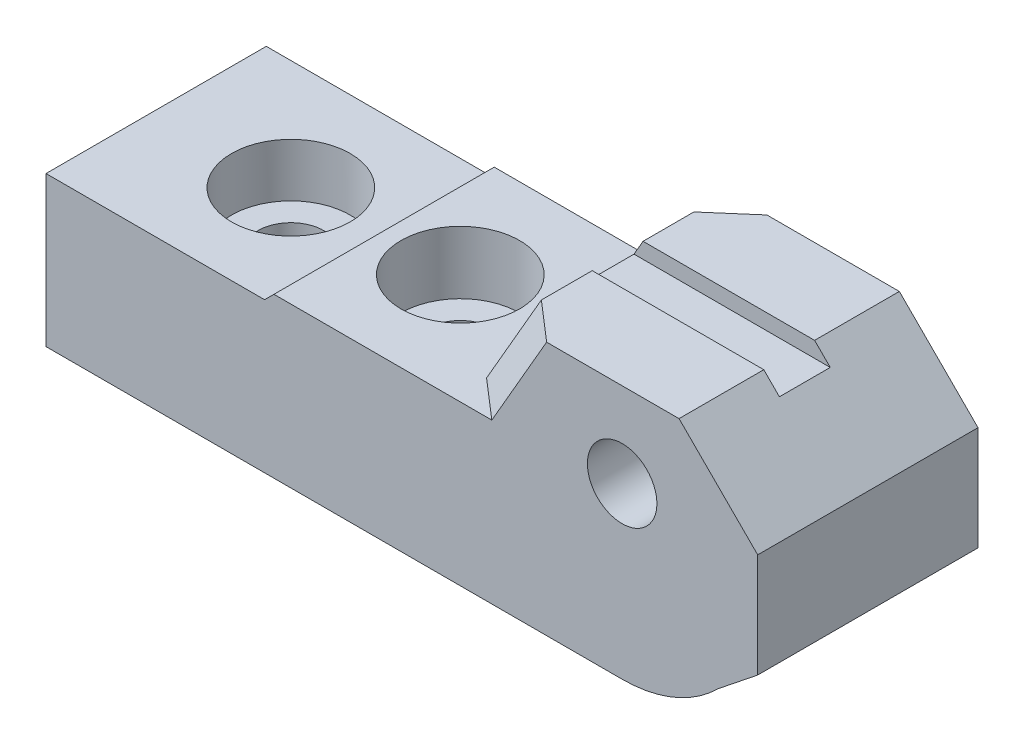
ISO-10303-21;
HEADER;
FILE_DESCRIPTION(('STEP AP214'),'2;1');
FILE_NAME('part.step','',(''),(''),'','','');
FILE_SCHEMA(('AUTOMOTIVE_DESIGN { 1 0 10303 214 1 1 1 1 }'));
ENDSEC;
DATA;
#1=APPLICATION_CONTEXT('core data for automotive mechanical design processes');
#2=APPLICATION_PROTOCOL_DEFINITION('international standard','automotive_design',2000,#1);
#3=PRODUCT_CONTEXT('',#1,'mechanical');
#4=PRODUCT('Part','Part','',(#3));
#5=PRODUCT_RELATED_PRODUCT_CATEGORY('part','',(#4));
#6=PRODUCT_DEFINITION_FORMATION('','',#4);
#7=PRODUCT_DEFINITION_CONTEXT('part definition',#1,'design');
#8=PRODUCT_DEFINITION('design','',#6,#7);
#9=PRODUCT_DEFINITION_SHAPE('','',#8);
#10=(LENGTH_UNIT() NAMED_UNIT(*) SI_UNIT(.MILLI.,.METRE.));
#11=(NAMED_UNIT(*) PLANE_ANGLE_UNIT() SI_UNIT($,.RADIAN.));
#12=(NAMED_UNIT(*) SI_UNIT($,.STERADIAN.) SOLID_ANGLE_UNIT());
#13=UNCERTAINTY_MEASURE_WITH_UNIT(LENGTH_MEASURE(1.E-05),#10,'distance_accuracy_value','');
#14=(GEOMETRIC_REPRESENTATION_CONTEXT(3) GLOBAL_UNCERTAINTY_ASSIGNED_CONTEXT((#13)) GLOBAL_UNIT_ASSIGNED_CONTEXT((#10,
#11,#12)) REPRESENTATION_CONTEXT('',''));
#15=CARTESIAN_POINT('',(0.,0.,0.));
#16=DIRECTION('',(0.,0.,1.));
#17=DIRECTION('',(1.,0.,0.));
#18=AXIS2_PLACEMENT_3D('',#15,#16,#17);
#19=CARTESIAN_POINT('',(37.3581756910183,15.,6.5));
#20=DIRECTION('',(-0.707106781186548,-0.707106781186546,0.));
#21=DIRECTION('',(0.707106781186547,-0.707106781186549,0.));
#22=AXIS2_PLACEMENT_3D('',#19,#20,#21);
#23=PLANE('',#22);
#24=DIRECTION('',(-0.707106781186547,0.707106781186549,0.));
#25=VECTOR('',#24,1.);
#26=CARTESIAN_POINT('',(37.3581756910183,15.,-1.5));
#27=LINE('',#26,#25);
#28=CARTESIAN_POINT('',(38.2811049377363,14.0770707532819,-1.5));
#29=VERTEX_POINT('',#28);
#30=CARTESIAN_POINT('',(37.3581756910183,15.,-1.5));
#31=VERTEX_POINT('',#30);
#32=EDGE_CURVE('E178',#29,#31,#27,.T.);
#33=ORIENTED_EDGE('',*,*,#32,.F.);
#34=DIRECTION('',(0.,0.,1.));
#35=VECTOR('',#34,1.);
#36=CARTESIAN_POINT('',(38.2811049377363,14.0770707532819,6.5));
#37=LINE('',#36,#35);
#38=CARTESIAN_POINT('',(38.2811049377363,14.0770707532819,1.5));
#39=VERTEX_POINT('',#38);
#40=EDGE_CURVE('E169',#29,#39,#37,.T.);
#41=ORIENTED_EDGE('',*,*,#40,.T.);
#42=DIRECTION('',(-0.707106781186547,0.707106781186549,0.));
#43=VECTOR('',#42,1.);
#44=CARTESIAN_POINT('',(37.3581756910183,15.,1.5));
#45=LINE('',#44,#43);
#46=CARTESIAN_POINT('',(37.3581756910183,15.,1.5));
#47=VERTEX_POINT('',#46);
#48=EDGE_CURVE('E152',#39,#47,#45,.T.);
#49=ORIENTED_EDGE('',*,*,#48,.T.);
#50=DIRECTION('',(0.,0.,-1.));
#51=VECTOR('',#50,1.);
#52=CARTESIAN_POINT('',(37.3581756910183,15.,6.5));
#53=LINE('',#52,#51);
#54=CARTESIAN_POINT('',(37.3581756910183,15.,6.5));
#55=VERTEX_POINT('',#54);
#56=EDGE_CURVE('E267',#55,#47,#53,.T.);
#57=ORIENTED_EDGE('',*,*,#56,.F.);
#58=DIRECTION('',(-0.707106781186546,0.707106781186549,0.));
#59=VECTOR('',#58,1.);
#60=CARTESIAN_POINT('',(37.3581756910183,15.,6.5));
#61=LINE('',#60,#59);
#62=CARTESIAN_POINT('',(42.,10.3581756910182,6.5));
#63=VERTEX_POINT('',#62);
#64=EDGE_CURVE('E220',#63,#55,#61,.T.);
#65=ORIENTED_EDGE('',*,*,#64,.F.);
#66=DIRECTION('',(0.,0.,-1.));
#67=VECTOR('',#66,1.);
#68=CARTESIAN_POINT('',(42.,10.3581756910182,6.5));
#69=LINE('',#68,#67);
#70=CARTESIAN_POINT('',(42.,10.3581756910182,-6.5));
#71=VERTEX_POINT('',#70);
#72=EDGE_CURVE('E269',#63,#71,#69,.T.);
#73=ORIENTED_EDGE('',*,*,#72,.T.);
#74=DIRECTION('',(-0.707106781186546,0.707106781186549,0.));
#75=VECTOR('',#74,1.);
#76=CARTESIAN_POINT('',(37.3581756910183,15.,-6.5));
#77=LINE('',#76,#75);
#78=CARTESIAN_POINT('',(37.3581756910183,15.,-6.5));
#79=VERTEX_POINT('',#78);
#80=EDGE_CURVE('E241',#71,#79,#77,.T.);
#81=ORIENTED_EDGE('',*,*,#80,.T.);
#82=EDGE_CURVE('E266',#31,#79,#53,.T.);
#83=ORIENTED_EDGE('',*,*,#82,.F.);
#84=EDGE_LOOP('',(#33,#41,#49,#57,#65,#73,#81,#83));
#85=FACE_BOUND('',#84,.T.);
#86=ADVANCED_FACE('F33',(#85),#23,.F.);
#87=CARTESIAN_POINT('',(27.2331615074619,15.,6.5));
#88=DIRECTION('',(0.,-1.,0.));
#89=DIRECTION('',(0.,0.,-1.));
#90=AXIS2_PLACEMENT_3D('',#87,#88,#89);
#91=PLANE('',#90);
#92=DIRECTION('',(-1.,0.,0.));
#93=VECTOR('',#92,1.);
#94=CARTESIAN_POINT('',(27.2331615074619,15.,-6.5));
#95=LINE('',#94,#93);
#96=CARTESIAN_POINT('',(29.5425625842204,15.,-6.5));
#97=VERTEX_POINT('',#96);
#98=EDGE_CURVE('E244',#79,#97,#95,.T.);
#99=ORIENTED_EDGE('',*,*,#98,.T.);
#100=DIRECTION('',(-0.755928946018455,0.,0.654653670707976));
#101=VECTOR('',#100,1.);
#102=CARTESIAN_POINT('',(25.3856406460551,15.,-2.90000000000002));
#103=LINE('',#102,#101);
#104=CARTESIAN_POINT('',(27.2331615074619,15.,-4.50000000000001));
#105=VERTEX_POINT('',#104);
#106=EDGE_CURVE('E302',#97,#105,#103,.T.);
#107=ORIENTED_EDGE('',*,*,#106,.T.);
#108=DIRECTION('',(0.,0.,-1.));
#109=VECTOR('',#108,1.);
#110=CARTESIAN_POINT('',(27.2331615074619,15.,6.5));
#111=LINE('',#110,#109);
#112=CARTESIAN_POINT('',(27.2331615074619,15.,-1.5));
#113=VERTEX_POINT('',#112);
#114=EDGE_CURVE('E263',#113,#105,#111,.T.);
#115=ORIENTED_EDGE('',*,*,#114,.F.);
#116=DIRECTION('',(-1.,0.,0.));
#117=VECTOR('',#116,1.);
#118=CARTESIAN_POINT('',(27.2331615074619,15.,-1.5));
#119=LINE('',#118,#117);
#120=EDGE_CURVE('E164',#31,#113,#119,.T.);
#121=ORIENTED_EDGE('',*,*,#120,.F.);
#122=ORIENTED_EDGE('',*,*,#82,.T.);
#123=EDGE_LOOP('',(#99,#107,#115,#121,#122));
#124=FACE_BOUND('',#123,.T.);
#125=ADVANCED_FACE('F322',(#124),#91,.F.);
#126=CARTESIAN_POINT('',(24.,9.4,6.5));
#127=DIRECTION('',(0.86602540378444,-0.499999999999998,0.));
#128=DIRECTION('',(0.499999999999998,0.86602540378444,0.));
#129=AXIS2_PLACEMENT_3D('',#126,#127,#128);
#130=PLANE('',#129);
#131=ORIENTED_EDGE('',*,*,#114,.T.);
#132=DIRECTION('',(-0.499999999999998,-0.86602540378444,0.));
#133=VECTOR('',#132,1.);
#134=CARTESIAN_POINT('',(24.,9.4,-4.50000000000001));
#135=LINE('',#134,#133);
#136=CARTESIAN_POINT('',(24.,9.4,-4.50000000000001));
#137=VERTEX_POINT('',#136);
#138=EDGE_CURVE('E297',#105,#137,#135,.T.);
#139=ORIENTED_EDGE('',*,*,#138,.T.);
#140=DIRECTION('',(0.,0.,-1.));
#141=VECTOR('',#140,1.);
#142=CARTESIAN_POINT('',(24.,9.4,6.5));
#143=LINE('',#142,#141);
#144=CARTESIAN_POINT('',(24.,9.4,4.49999999999999));
#145=VERTEX_POINT('',#144);
#146=EDGE_CURVE('E260',#145,#137,#143,.T.);
#147=ORIENTED_EDGE('',*,*,#146,.F.);
#148=DIRECTION('',(0.499999999999998,0.86602540378444,0.));
#149=VECTOR('',#148,1.);
#150=CARTESIAN_POINT('',(24.,9.4,4.49999999999999));
#151=LINE('',#150,#149);
#152=CARTESIAN_POINT('',(27.2331615074619,15.,4.49999999999999));
#153=VERTEX_POINT('',#152);
#154=EDGE_CURVE('E295',#145,#153,#151,.T.);
#155=ORIENTED_EDGE('',*,*,#154,.T.);
#156=CARTESIAN_POINT('',(27.2331615074619,15.,1.5));
#157=VERTEX_POINT('',#156);
#158=EDGE_CURVE('E264',#153,#157,#111,.T.);
#159=ORIENTED_EDGE('',*,*,#158,.T.);
#160=DIRECTION('',(-0.499999999999998,-0.86602540378444,0.));
#161=VECTOR('',#160,1.);
#162=CARTESIAN_POINT('',(24.,9.4,1.5));
#163=LINE('',#162,#161);
#164=CARTESIAN_POINT('',(26.7003080584262,14.0770707532819,1.5));
#165=VERTEX_POINT('',#164);
#166=EDGE_CURVE('E284',#157,#165,#163,.T.);
#167=ORIENTED_EDGE('',*,*,#166,.T.);
#168=DIRECTION('',(0.,0.,-1.));
#169=VECTOR('',#168,1.);
#170=CARTESIAN_POINT('',(26.7003080584262,14.0770707532819,6.5));
#171=LINE('',#170,#169);
#172=CARTESIAN_POINT('',(26.7003080584262,14.0770707532819,-1.5));
#173=VERTEX_POINT('',#172);
#174=EDGE_CURVE('E172',#165,#173,#171,.T.);
#175=ORIENTED_EDGE('',*,*,#174,.T.);
#176=DIRECTION('',(-0.499999999999998,-0.86602540378444,0.));
#177=VECTOR('',#176,1.);
#178=CARTESIAN_POINT('',(24.,9.4,-1.5));
#179=LINE('',#178,#177);
#180=EDGE_CURVE('E293',#113,#173,#179,.T.);
#181=ORIENTED_EDGE('',*,*,#180,.F.);
#182=EDGE_LOOP('',(#131,#139,#147,#155,#159,#167,#175,#181));
#183=FACE_BOUND('',#182,.T.);
#184=ADVANCED_FACE('F365',(#183),#130,.F.);
#185=CARTESIAN_POINT('',(17.95,15.,0.));
#186=DIRECTION('',(0.,-1.,0.));
#187=DIRECTION('',(0.,0.,-1.));
#188=AXIS2_PLACEMENT_3D('',#185,#186,#187);
#189=CYLINDRICAL_SURFACE('',#188,1.925);
#190=CARTESIAN_POINT('',(17.95,0.,0.));
#191=DIRECTION('',(0.,1.,0.));
#192=DIRECTION('',(0.,0.,1.));
#193=AXIS2_PLACEMENT_3D('',#190,#191,#192);
#194=CIRCLE('',#193,1.925);
#195=CARTESIAN_POINT('',(17.95,0.,1.925));
#196=VERTEX_POINT('',#195);
#197=EDGE_CURVE('E194',#196,#196,#194,.T.);
#198=ORIENTED_EDGE('',*,*,#197,.F.);
#199=EDGE_LOOP('',(#198));
#200=FACE_BOUND('',#199,.T.);
#201=CARTESIAN_POINT('',(17.95,5.7,0.));
#202=DIRECTION('',(0.,1.,0.));
#203=DIRECTION('',(0.,0.,1.));
#204=AXIS2_PLACEMENT_3D('',#201,#202,#203);
#205=CIRCLE('',#204,1.925);
#206=CARTESIAN_POINT('',(17.95,5.7,1.925));
#207=VERTEX_POINT('',#206);
#208=EDGE_CURVE('E188',#207,#207,#205,.T.);
#209=ORIENTED_EDGE('',*,*,#208,.T.);
#210=EDGE_LOOP('',(#209));
#211=FACE_BOUND('',#210,.T.);
#212=ADVANCED_FACE('F426',(#200,#211),#189,.F.);
#213=CARTESIAN_POINT('',(7.95,15.,0.));
#214=DIRECTION('',(0.,-1.,0.));
#215=DIRECTION('',(0.,0.,-1.));
#216=AXIS2_PLACEMENT_3D('',#213,#214,#215);
#217=CYLINDRICAL_SURFACE('',#216,1.925);
#218=CARTESIAN_POINT('',(7.95,0.,0.));
#219=DIRECTION('',(0.,1.,0.));
#220=DIRECTION('',(0.,0.,1.));
#221=AXIS2_PLACEMENT_3D('',#218,#219,#220);
#222=CIRCLE('',#221,1.925);
#223=CARTESIAN_POINT('',(7.95,0.,1.925));
#224=VERTEX_POINT('',#223);
#225=EDGE_CURVE('E197',#224,#224,#222,.T.);
#226=ORIENTED_EDGE('',*,*,#225,.F.);
#227=EDGE_LOOP('',(#226));
#228=FACE_BOUND('',#227,.T.);
#229=CARTESIAN_POINT('',(7.95,5.7,0.));
#230=DIRECTION('',(0.,1.,0.));
#231=DIRECTION('',(0.,0.,1.));
#232=AXIS2_PLACEMENT_3D('',#229,#230,#231);
#233=CIRCLE('',#232,1.925);
#234=CARTESIAN_POINT('',(7.95,5.7,1.925));
#235=VERTEX_POINT('',#234);
#236=EDGE_CURVE('E193',#235,#235,#233,.T.);
#237=ORIENTED_EDGE('',*,*,#236,.T.);
#238=EDGE_LOOP('',(#237));
#239=FACE_BOUND('',#238,.T.);
#240=ADVANCED_FACE('F429',(#228,#239),#217,.F.);
#241=CARTESIAN_POINT('',(34.,8.,6.5));
#242=DIRECTION('',(0.,0.,-1.));
#243=DIRECTION('',(-1.,0.,0.));
#244=AXIS2_PLACEMENT_3D('',#241,#242,#243);
#245=PLANE('',#244);
#246=DIRECTION('',(-1.,0.,0.));
#247=VECTOR('',#246,1.);
#248=CARTESIAN_POINT('',(27.2331615074619,15.,6.5));
#249=LINE('',#248,#247);
#250=CARTESIAN_POINT('',(29.5425625842204,15.,6.5));
#251=VERTEX_POINT('',#250);
#252=EDGE_CURVE('E222',#55,#251,#249,.T.);
#253=ORIENTED_EDGE('',*,*,#252,.T.);
#254=DIRECTION('',(-0.499999999999998,-0.86602540378444,0.));
#255=VECTOR('',#254,1.);
#256=CARTESIAN_POINT('',(27.6258330249197,11.6801270189222,6.5));
#257=LINE('',#256,#255);
#258=CARTESIAN_POINT('',(26.3094010767585,9.4,6.5));
#259=VERTEX_POINT('',#258);
#260=EDGE_CURVE('E304',#251,#259,#257,.T.);
#261=ORIENTED_EDGE('',*,*,#260,.T.);
#262=DIRECTION('',(-1.,0.,0.));
#263=VECTOR('',#262,1.);
#264=CARTESIAN_POINT('',(13.4517455632445,9.4,6.5));
#265=LINE('',#264,#263);
#266=CARTESIAN_POINT('',(13.4517455632445,9.4,6.5));
#267=VERTEX_POINT('',#266);
#268=EDGE_CURVE('E47',#259,#267,#265,.T.);
#269=ORIENTED_EDGE('',*,*,#268,.T.);
#270=DIRECTION('',(-0.707106781186546,-0.707106781186549,0.));
#271=VECTOR('',#270,1.);
#272=CARTESIAN_POINT('',(12.8987844867532,8.84703892350865,6.5));
#273=LINE('',#272,#271);
#274=CARTESIAN_POINT('',(12.8987844867532,8.84703892350865,6.5));
#275=VERTEX_POINT('',#274);
#276=EDGE_CURVE('E225',#267,#275,#273,.T.);
#277=ORIENTED_EDGE('',*,*,#276,.T.);
#278=DIRECTION('',(-1.,0.,0.));
#279=VECTOR('',#278,1.);
#280=CARTESIAN_POINT('',(0.,8.84703892350865,6.5));
#281=LINE('',#280,#279);
#282=CARTESIAN_POINT('',(0.,8.84703892350865,6.5));
#283=VERTEX_POINT('',#282);
#284=EDGE_CURVE('E227',#275,#283,#281,.T.);
#285=ORIENTED_EDGE('',*,*,#284,.T.);
#286=DIRECTION('',(0.,-1.,0.));
#287=VECTOR('',#286,1.);
#288=CARTESIAN_POINT('',(0.,0.,6.5));
#289=LINE('',#288,#287);
#290=CARTESIAN_POINT('',(0.,0.,6.5));
#291=VERTEX_POINT('',#290);
#292=EDGE_CURVE('E208',#283,#291,#289,.T.);
#293=ORIENTED_EDGE('',*,*,#292,.T.);
#294=DIRECTION('',(1.,0.,0.));
#295=VECTOR('',#294,1.);
#296=CARTESIAN_POINT('',(0.,0.,6.5));
#297=LINE('',#296,#295);
#298=CARTESIAN_POINT('',(34.,0.,6.5));
#299=VERTEX_POINT('',#298);
#300=EDGE_CURVE('E211',#291,#299,#297,.T.);
#301=ORIENTED_EDGE('',*,*,#300,.T.);
#302=CARTESIAN_POINT('',(34.,8.,6.5));
#303=DIRECTION('',(0.,0.,1.));
#304=DIRECTION('',(-1.,0.,0.));
#305=AXIS2_PLACEMENT_3D('',#302,#303,#304);
#306=CIRCLE('',#305,8.);
#307=CARTESIAN_POINT('',(39.6568542494924,2.34314575050762,6.5));
#308=VERTEX_POINT('',#307);
#309=EDGE_CURVE('E214',#299,#308,#306,.T.);
#310=ORIENTED_EDGE('',*,*,#309,.T.);
#311=DIRECTION('',(0.781363158920766,0.624076608984315,0.));
#312=VECTOR('',#311,1.);
#313=CARTESIAN_POINT('',(39.6568542494924,2.34314575050762,6.5));
#314=LINE('',#313,#312);
#315=CARTESIAN_POINT('',(42.,4.21462182106176,6.5));
#316=VERTEX_POINT('',#315);
#317=EDGE_CURVE('E216',#308,#316,#314,.T.);
#318=ORIENTED_EDGE('',*,*,#317,.T.);
#319=DIRECTION('',(0.,1.,0.));
#320=VECTOR('',#319,1.);
#321=CARTESIAN_POINT('',(42.,8.,6.5));
#322=LINE('',#321,#320);
#323=EDGE_CURVE('E218',#316,#63,#322,.T.);
#324=ORIENTED_EDGE('',*,*,#323,.T.);
#325=ORIENTED_EDGE('',*,*,#64,.T.);
#326=EDGE_LOOP('',(#253,#261,#269,#277,#285,#293,#301,#310,#318,#324,#325));
#327=FACE_BOUND('',#326,.T.);
#328=CARTESIAN_POINT('',(34.,10.,6.5));
#329=DIRECTION('',(0.,0.,1.));
#330=DIRECTION('',(1.,0.,0.));
#331=AXIS2_PLACEMENT_3D('',#328,#329,#330);
#332=CIRCLE('',#331,2.04999999999999);
#333=CARTESIAN_POINT('',(31.95,10.,6.5));
#334=VERTEX_POINT('',#333);
#335=EDGE_CURVE('E202',#334,#334,#332,.T.);
#336=ORIENTED_EDGE('',*,*,#335,.F.);
#337=EDGE_LOOP('',(#336));
#338=FACE_BOUND('',#337,.T.);
#339=ADVANCED_FACE('F339',(#327,#338),#245,.F.);
#340=CARTESIAN_POINT('',(34.,8.,-6.5));
#341=DIRECTION('',(0.,0.,-1.));
#342=DIRECTION('',(-1.,0.,0.));
#343=AXIS2_PLACEMENT_3D('',#340,#341,#342);
#344=PLANE('',#343);
#345=DIRECTION('',(-1.,0.,0.));
#346=VECTOR('',#345,1.);
#347=CARTESIAN_POINT('',(13.4517455632445,9.4,-6.5));
#348=LINE('',#347,#346);
#349=CARTESIAN_POINT('',(26.3094010767585,9.4,-6.5));
#350=VERTEX_POINT('',#349);
#351=CARTESIAN_POINT('',(13.4517455632445,9.4,-6.5));
#352=VERTEX_POINT('',#351);
#353=EDGE_CURVE('E247',#350,#352,#348,.T.);
#354=ORIENTED_EDGE('',*,*,#353,.F.);
#355=DIRECTION('',(0.499999999999998,0.86602540378444,0.));
#356=VECTOR('',#355,1.);
#357=CARTESIAN_POINT('',(28.9652123150308,14.,-6.5));
#358=LINE('',#357,#356);
#359=EDGE_CURVE('E300',#350,#97,#358,.T.);
#360=ORIENTED_EDGE('',*,*,#359,.T.);
#361=ORIENTED_EDGE('',*,*,#98,.F.);
#362=ORIENTED_EDGE('',*,*,#80,.F.);
#363=DIRECTION('',(0.,1.,0.));
#364=VECTOR('',#363,1.);
#365=CARTESIAN_POINT('',(42.,8.,-6.5));
#366=LINE('',#365,#364);
#367=CARTESIAN_POINT('',(42.,4.21462182106176,-6.5));
#368=VERTEX_POINT('',#367);
#369=EDGE_CURVE('E239',#368,#71,#366,.T.);
#370=ORIENTED_EDGE('',*,*,#369,.F.);
#371=DIRECTION('',(0.781363158920766,0.624076608984315,0.));
#372=VECTOR('',#371,1.);
#373=CARTESIAN_POINT('',(39.6568542494924,2.34314575050762,-6.5));
#374=LINE('',#373,#372);
#375=CARTESIAN_POINT('',(39.6568542494924,2.34314575050762,-6.5));
#376=VERTEX_POINT('',#375);
#377=EDGE_CURVE('E236',#376,#368,#374,.T.);
#378=ORIENTED_EDGE('',*,*,#377,.F.);
#379=CARTESIAN_POINT('',(34.,8.,-6.5));
#380=DIRECTION('',(0.,0.,1.));
#381=DIRECTION('',(-1.,0.,0.));
#382=AXIS2_PLACEMENT_3D('',#379,#380,#381);
#383=CIRCLE('',#382,8.);
#384=CARTESIAN_POINT('',(34.,0.,-6.5));
#385=VERTEX_POINT('',#384);
#386=EDGE_CURVE('E234',#385,#376,#383,.T.);
#387=ORIENTED_EDGE('',*,*,#386,.F.);
#388=DIRECTION('',(1.,0.,0.));
#389=VECTOR('',#388,1.);
#390=CARTESIAN_POINT('',(0.,0.,-6.5));
#391=LINE('',#390,#389);
#392=CARTESIAN_POINT('',(0.,0.,-6.5));
#393=VERTEX_POINT('',#392);
#394=EDGE_CURVE('E232',#393,#385,#391,.T.);
#395=ORIENTED_EDGE('',*,*,#394,.F.);
#396=DIRECTION('',(0.,-1.,0.));
#397=VECTOR('',#396,1.);
#398=CARTESIAN_POINT('',(0.,0.,-6.5));
#399=LINE('',#398,#397);
#400=CARTESIAN_POINT('',(0.,8.84703892350865,-6.5));
#401=VERTEX_POINT('',#400);
#402=EDGE_CURVE('E205',#401,#393,#399,.T.);
#403=ORIENTED_EDGE('',*,*,#402,.F.);
#404=DIRECTION('',(-1.,0.,0.));
#405=VECTOR('',#404,1.);
#406=CARTESIAN_POINT('',(0.,8.84703892350865,-6.5));
#407=LINE('',#406,#405);
#408=CARTESIAN_POINT('',(12.8987844867532,8.84703892350865,-6.5));
#409=VERTEX_POINT('',#408);
#410=EDGE_CURVE('E212',#409,#401,#407,.T.);
#411=ORIENTED_EDGE('',*,*,#410,.F.);
#412=DIRECTION('',(-0.707106781186546,-0.707106781186549,0.));
#413=VECTOR('',#412,1.);
#414=CARTESIAN_POINT('',(12.8987844867532,8.84703892350865,-6.5));
#415=LINE('',#414,#413);
#416=EDGE_CURVE('E249',#352,#409,#415,.T.);
#417=ORIENTED_EDGE('',*,*,#416,.F.);
#418=EDGE_LOOP('',(#354,#360,#361,#362,#370,#378,#387,#395,#403,#411,#417));
#419=FACE_BOUND('',#418,.T.);
#420=CARTESIAN_POINT('',(34.,10.,-6.5));
#421=DIRECTION('',(0.,0.,1.));
#422=DIRECTION('',(1.,0.,0.));
#423=AXIS2_PLACEMENT_3D('',#420,#421,#422);
#424=CIRCLE('',#423,2.04999999999999);
#425=CARTESIAN_POINT('',(31.95,10.,-6.5));
#426=VERTEX_POINT('',#425);
#427=EDGE_CURVE('E201',#426,#426,#424,.T.);
#428=ORIENTED_EDGE('',*,*,#427,.T.);
#429=EDGE_LOOP('',(#428));
#430=FACE_BOUND('',#429,.T.);
#431=ADVANCED_FACE('F317',(#419,#430),#344,.T.);
#432=CARTESIAN_POINT('',(0.,0.,6.5));
#433=DIRECTION('',(1.,0.,0.));
#434=DIRECTION('',(0.,0.,-1.));
#435=AXIS2_PLACEMENT_3D('',#432,#433,#434);
#436=PLANE('',#435);
#437=ORIENTED_EDGE('',*,*,#402,.T.);
#438=DIRECTION('',(0.,0.,-1.));
#439=VECTOR('',#438,1.);
#440=CARTESIAN_POINT('',(0.,0.,6.5));
#441=LINE('',#440,#439);
#442=EDGE_CURVE('E281',#291,#393,#441,.T.);
#443=ORIENTED_EDGE('',*,*,#442,.F.);
#444=ORIENTED_EDGE('',*,*,#292,.F.);
#445=DIRECTION('',(0.,0.,-1.));
#446=VECTOR('',#445,1.);
#447=CARTESIAN_POINT('',(0.,8.84703892350865,6.5));
#448=LINE('',#447,#446);
#449=EDGE_CURVE('E229',#283,#401,#448,.T.);
#450=ORIENTED_EDGE('',*,*,#449,.T.);
#451=EDGE_LOOP('',(#437,#443,#444,#450));
#452=FACE_BOUND('',#451,.T.);
#453=ADVANCED_FACE('F352',(#452),#436,.F.);
#454=CARTESIAN_POINT('',(0.,0.,6.5));
#455=DIRECTION('',(0.,1.,0.));
#456=DIRECTION('',(0.,0.,1.));
#457=AXIS2_PLACEMENT_3D('',#454,#455,#456);
#458=PLANE('',#457);
#459=ORIENTED_EDGE('',*,*,#197,.T.);
#460=EDGE_LOOP('',(#459));
#461=FACE_BOUND('',#460,.T.);
#462=ORIENTED_EDGE('',*,*,#225,.T.);
#463=EDGE_LOOP('',(#462));
#464=FACE_BOUND('',#463,.T.);
#465=ORIENTED_EDGE('',*,*,#394,.T.);
#466=DIRECTION('',(0.,0.,-1.));
#467=VECTOR('',#466,1.);
#468=CARTESIAN_POINT('',(34.,0.,6.5));
#469=LINE('',#468,#467);
#470=EDGE_CURVE('E278',#299,#385,#469,.T.);
#471=ORIENTED_EDGE('',*,*,#470,.F.);
#472=ORIENTED_EDGE('',*,*,#300,.F.);
#473=ORIENTED_EDGE('',*,*,#442,.T.);
#474=EDGE_LOOP('',(#465,#471,#472,#473));
#475=FACE_BOUND('',#474,.T.);
#476=ADVANCED_FACE('F349',(#461,#464,#475),#458,.F.);
#477=CARTESIAN_POINT('',(34.,8.,6.5));
#478=DIRECTION('',(0.,0.,-1.));
#479=DIRECTION('',(-1.,0.,0.));
#480=AXIS2_PLACEMENT_3D('',#477,#478,#479);
#481=CYLINDRICAL_SURFACE('',#480,8.);
#482=ORIENTED_EDGE('',*,*,#386,.T.);
#483=DIRECTION('',(0.,0.,-1.));
#484=VECTOR('',#483,1.);
#485=CARTESIAN_POINT('',(39.6568542494924,2.34314575050762,6.5));
#486=LINE('',#485,#484);
#487=EDGE_CURVE('E275',#308,#376,#486,.T.);
#488=ORIENTED_EDGE('',*,*,#487,.F.);
#489=ORIENTED_EDGE('',*,*,#309,.F.);
#490=ORIENTED_EDGE('',*,*,#470,.T.);
#491=EDGE_LOOP('',(#482,#488,#489,#490));
#492=FACE_BOUND('',#491,.T.);
#493=ADVANCED_FACE('F344',(#492),#481,.T.);
#494=CARTESIAN_POINT('',(39.6568542494924,2.34314575050762,6.5));
#495=DIRECTION('',(-0.624076608984315,0.781363158920766,0.));
#496=DIRECTION('',(-0.781363158920766,-0.624076608984315,0.));
#497=AXIS2_PLACEMENT_3D('',#494,#495,#496);
#498=PLANE('',#497);
#499=ORIENTED_EDGE('',*,*,#377,.T.);
#500=DIRECTION('',(0.,0.,-1.));
#501=VECTOR('',#500,1.);
#502=CARTESIAN_POINT('',(42.,4.21462182106176,6.5));
#503=LINE('',#502,#501);
#504=EDGE_CURVE('E272',#316,#368,#503,.T.);
#505=ORIENTED_EDGE('',*,*,#504,.F.);
#506=ORIENTED_EDGE('',*,*,#317,.F.);
#507=ORIENTED_EDGE('',*,*,#487,.T.);
#508=EDGE_LOOP('',(#499,#505,#506,#507));
#509=FACE_BOUND('',#508,.T.);
#510=ADVANCED_FACE('F333',(#509),#498,.F.);
#511=CARTESIAN_POINT('',(42.,8.,6.5));
#512=DIRECTION('',(-1.,0.,0.));
#513=DIRECTION('',(0.,0.,1.));
#514=AXIS2_PLACEMENT_3D('',#511,#512,#513);
#515=PLANE('',#514);
#516=ORIENTED_EDGE('',*,*,#369,.T.);
#517=ORIENTED_EDGE('',*,*,#72,.F.);
#518=ORIENTED_EDGE('',*,*,#323,.F.);
#519=ORIENTED_EDGE('',*,*,#504,.T.);
#520=EDGE_LOOP('',(#516,#517,#518,#519));
#521=FACE_BOUND('',#520,.T.);
#522=ADVANCED_FACE('F337',(#521),#515,.F.);
#523=ORIENTED_EDGE('',*,*,#158,.F.);
#524=DIRECTION('',(-0.755928946018452,0.,-0.65465367070798));
#525=VECTOR('',#524,1.);
#526=CARTESIAN_POINT('',(28.4472885503343,15.,5.5514648625492));
#527=LINE('',#526,#525);
#528=EDGE_CURVE('E55',#153,#251,#527,.F.);
#529=ORIENTED_EDGE('',*,*,#528,.T.);
#530=ORIENTED_EDGE('',*,*,#252,.F.);
#531=ORIENTED_EDGE('',*,*,#56,.T.);
#532=DIRECTION('',(-1.,0.,0.));
#533=VECTOR('',#532,1.);
#534=CARTESIAN_POINT('',(27.2331615074619,15.,1.5));
#535=LINE('',#534,#533);
#536=EDGE_CURVE('E159',#47,#157,#535,.T.);
#537=ORIENTED_EDGE('',*,*,#536,.T.);
#538=EDGE_LOOP('',(#523,#529,#530,#531,#537));
#539=FACE_BOUND('',#538,.T.);
#540=ADVANCED_FACE('F371',(#539),#91,.F.);
#541=CARTESIAN_POINT('',(13.4517455632445,9.4,6.5));
#542=DIRECTION('',(0.,-1.,0.));
#543=DIRECTION('',(1.,0.,0.));
#544=AXIS2_PLACEMENT_3D('',#541,#542,#543);
#545=PLANE('',#544);
#546=CARTESIAN_POINT('',(17.95,9.4,0.));
#547=DIRECTION('',(0.,1.,0.));
#548=DIRECTION('',(0.,0.,1.));
#549=AXIS2_PLACEMENT_3D('',#546,#547,#548);
#550=CIRCLE('',#549,3.5);
#551=CARTESIAN_POINT('',(17.95,9.4,3.5));
#552=VERTEX_POINT('',#551);
#553=EDGE_CURVE('E179',#552,#552,#550,.T.);
#554=ORIENTED_EDGE('',*,*,#553,.F.);
#555=EDGE_LOOP('',(#554));
#556=FACE_BOUND('',#555,.T.);
#557=ORIENTED_EDGE('',*,*,#353,.T.);
#558=DIRECTION('',(0.,0.,-1.));
#559=VECTOR('',#558,1.);
#560=CARTESIAN_POINT('',(13.4517455632445,9.4,6.5));
#561=LINE('',#560,#559);
#562=EDGE_CURVE('E257',#267,#352,#561,.T.);
#563=ORIENTED_EDGE('',*,*,#562,.F.);
#564=ORIENTED_EDGE('',*,*,#268,.F.);
#565=DIRECTION('',(0.755928946018452,0.,0.65465367070798));
#566=VECTOR('',#565,1.);
#567=CARTESIAN_POINT('',(18.9621693547506,9.4,0.137110681250191));
#568=LINE('',#567,#566);
#569=EDGE_CURVE('E11',#259,#145,#568,.F.);
#570=ORIENTED_EDGE('',*,*,#569,.T.);
#571=ORIENTED_EDGE('',*,*,#146,.T.);
#572=DIRECTION('',(0.755928946018455,0.,-0.654653670707976));
#573=VECTOR('',#572,1.);
#574=CARTESIAN_POINT('',(12.5288377837804,9.4,5.43431789017836));
#575=LINE('',#574,#573);
#576=EDGE_CURVE('E41',#137,#350,#575,.T.);
#577=ORIENTED_EDGE('',*,*,#576,.T.);
#578=EDGE_LOOP('',(#557,#563,#564,#570,#571,#577));
#579=FACE_BOUND('',#578,.T.);
#580=ADVANCED_FACE('F309',(#556,#579),#545,.F.);
#581=CARTESIAN_POINT('',(12.8987844867532,8.84703892350865,6.5));
#582=DIRECTION('',(0.707106781186549,-0.707106781186546,0.));
#583=DIRECTION('',(0.707106781186546,0.707106781186549,0.));
#584=AXIS2_PLACEMENT_3D('',#581,#582,#583);
#585=PLANE('',#584);
#586=ORIENTED_EDGE('',*,*,#416,.T.);
#587=DIRECTION('',(0.,0.,-1.));
#588=VECTOR('',#587,1.);
#589=CARTESIAN_POINT('',(12.8987844867532,8.84703892350865,6.5));
#590=LINE('',#589,#588);
#591=EDGE_CURVE('E254',#275,#409,#590,.T.);
#592=ORIENTED_EDGE('',*,*,#591,.F.);
#593=ORIENTED_EDGE('',*,*,#276,.F.);
#594=ORIENTED_EDGE('',*,*,#562,.T.);
#595=EDGE_LOOP('',(#586,#592,#593,#594));
#596=FACE_BOUND('',#595,.T.);
#597=ADVANCED_FACE('F359',(#596),#585,.F.);
#598=CARTESIAN_POINT('',(0.,8.84703892350865,6.5));
#599=DIRECTION('',(0.,-1.,0.));
#600=DIRECTION('',(0.,0.,-1.));
#601=AXIS2_PLACEMENT_3D('',#598,#599,#600);
#602=PLANE('',#601);
#603=CARTESIAN_POINT('',(7.95,8.84703892350865,0.));
#604=DIRECTION('',(0.,-1.,0.));
#605=DIRECTION('',(0.,0.,-1.));
#606=AXIS2_PLACEMENT_3D('',#603,#604,#605);
#607=CIRCLE('',#606,3.5);
#608=CARTESIAN_POINT('',(7.95,8.84703892350865,-3.5));
#609=VERTEX_POINT('',#608);
#610=EDGE_CURVE('E198',#609,#609,#607,.T.);
#611=ORIENTED_EDGE('',*,*,#610,.T.);
#612=EDGE_LOOP('',(#611));
#613=FACE_BOUND('',#612,.T.);
#614=ORIENTED_EDGE('',*,*,#410,.T.);
#615=ORIENTED_EDGE('',*,*,#449,.F.);
#616=ORIENTED_EDGE('',*,*,#284,.F.);
#617=ORIENTED_EDGE('',*,*,#591,.T.);
#618=EDGE_LOOP('',(#614,#615,#616,#617));
#619=FACE_BOUND('',#618,.T.);
#620=ADVANCED_FACE('F356',(#613,#619),#602,.F.);
#621=CARTESIAN_POINT('',(34.,10.,6.5));
#622=DIRECTION('',(0.,0.,-1.));
#623=DIRECTION('',(-1.,0.,0.));
#624=AXIS2_PLACEMENT_3D('',#621,#622,#623);
#625=CYLINDRICAL_SURFACE('',#624,2.04999999999999);
#626=CARTESIAN_POINT('',(31.95,10.,6.5));
#627=CARTESIAN_POINT('',(31.95,10.,6.36458333333333));
#628=CARTESIAN_POINT('',(31.95,10.,6.22916666666667));
#629=CARTESIAN_POINT('',(31.95,10.,5.95833333333333));
#630=CARTESIAN_POINT('',(31.95,10.,5.82291666666667));
#631=CARTESIAN_POINT('',(31.95,10.,5.55208333333333));
#632=CARTESIAN_POINT('',(31.95,10.,5.41666666666667));
#633=CARTESIAN_POINT('',(31.95,10.,5.14583333333333));
#634=CARTESIAN_POINT('',(31.95,10.,5.01041666666667));
#635=CARTESIAN_POINT('',(31.95,10.,4.73958333333333));
#636=CARTESIAN_POINT('',(31.95,10.,4.60416666666667));
#637=CARTESIAN_POINT('',(31.95,10.,4.33333333333333));
#638=CARTESIAN_POINT('',(31.95,10.,4.19791666666667));
#639=CARTESIAN_POINT('',(31.95,10.,3.92708333333333));
#640=CARTESIAN_POINT('',(31.95,10.,3.79166666666667));
#641=CARTESIAN_POINT('',(31.95,10.,3.52083333333333));
#642=CARTESIAN_POINT('',(31.95,10.,3.38541666666667));
#643=CARTESIAN_POINT('',(31.95,10.,3.11458333333333));
#644=CARTESIAN_POINT('',(31.95,10.,2.97916666666667));
#645=CARTESIAN_POINT('',(31.95,10.,2.70833333333333));
#646=CARTESIAN_POINT('',(31.95,10.,2.57291666666667));
#647=CARTESIAN_POINT('',(31.95,10.,2.30208333333333));
#648=CARTESIAN_POINT('',(31.95,10.,2.16666666666667));
#649=CARTESIAN_POINT('',(31.95,10.,1.89583333333333));
#650=CARTESIAN_POINT('',(31.95,10.,1.76041666666667));
#651=CARTESIAN_POINT('',(31.95,10.,1.48958333333333));
#652=CARTESIAN_POINT('',(31.95,10.,1.35416666666667));
#653=CARTESIAN_POINT('',(31.95,10.,1.08333333333333));
#654=CARTESIAN_POINT('',(31.95,10.,0.947916666666666));
#655=CARTESIAN_POINT('',(31.95,10.,0.677083333333332));
#656=CARTESIAN_POINT('',(31.95,10.,0.541666666666666));
#657=CARTESIAN_POINT('',(31.95,10.,0.270833333333333));
#658=CARTESIAN_POINT('',(31.95,10.,0.135416666666666));
#659=CARTESIAN_POINT('',(31.95,10.,-0.135416666666668));
#660=CARTESIAN_POINT('',(31.95,10.,-0.270833333333334));
#661=CARTESIAN_POINT('',(31.95,10.,-0.541666666666668));
#662=CARTESIAN_POINT('',(31.95,10.,-0.677083333333334));
#663=CARTESIAN_POINT('',(31.95,10.,-0.947916666666667));
#664=CARTESIAN_POINT('',(31.95,10.,-1.08333333333333));
#665=CARTESIAN_POINT('',(31.95,10.,-1.35416666666667));
#666=CARTESIAN_POINT('',(31.95,10.,-1.48958333333333));
#667=CARTESIAN_POINT('',(31.95,10.,-1.76041666666667));
#668=CARTESIAN_POINT('',(31.95,10.,-1.89583333333333));
#669=CARTESIAN_POINT('',(31.95,10.,-2.16666666666667));
#670=CARTESIAN_POINT('',(31.95,10.,-2.30208333333333));
#671=CARTESIAN_POINT('',(31.95,10.,-2.57291666666667));
#672=CARTESIAN_POINT('',(31.95,10.,-2.70833333333333));
#673=CARTESIAN_POINT('',(31.95,10.,-2.97916666666667));
#674=CARTESIAN_POINT('',(31.95,10.,-3.11458333333333));
#675=CARTESIAN_POINT('',(31.95,10.,-3.38541666666667));
#676=CARTESIAN_POINT('',(31.95,10.,-3.52083333333333));
#677=CARTESIAN_POINT('',(31.95,10.,-3.79166666666667));
#678=CARTESIAN_POINT('',(31.95,10.,-3.92708333333333));
#679=CARTESIAN_POINT('',(31.95,10.,-4.19791666666667));
#680=CARTESIAN_POINT('',(31.95,10.,-4.33333333333333));
#681=CARTESIAN_POINT('',(31.95,10.,-4.60416666666667));
#682=CARTESIAN_POINT('',(31.95,10.,-4.73958333333333));
#683=CARTESIAN_POINT('',(31.95,10.,-5.01041666666667));
#684=CARTESIAN_POINT('',(31.95,10.,-5.14583333333333));
#685=CARTESIAN_POINT('',(31.95,10.,-5.41666666666667));
#686=CARTESIAN_POINT('',(31.95,10.,-5.55208333333333));
#687=CARTESIAN_POINT('',(31.95,10.,-5.82291666666667));
#688=CARTESIAN_POINT('',(31.95,10.,-5.95833333333333));
#689=CARTESIAN_POINT('',(31.95,10.,-6.22916666666667));
#690=CARTESIAN_POINT('',(31.95,10.,-6.36458333333333));
#691=CARTESIAN_POINT('',(31.95,10.,-6.5));
#692=B_SPLINE_CURVE_WITH_KNOTS('',3,(#626,#627,#628,#629,#630,#631,#632,#633,#634,#635,#636,
#637,#638,#639,#640,#641,#642,#643,#644,#645,#646,#647,#648,#649,#650,#651,#652,#653,#654,#655,
#656,#657,#658,#659,#660,#661,#662,#663,#664,#665,#666,#667,#668,#669,#670,#671,#672,#673,#674,
#675,#676,#677,#678,#679,#680,#681,#682,#683,#684,#685,#686,#687,#688,#689,#690,#691),
.UNSPECIFIED.,.F.,.F.,(4,2,2,2,2,2,2,2,2,2,2,2,2,2,2,2,2,2,2,2,2,2,2,2,2,2,2,2,2,2,2,2,4),(0.,
0.40625,0.8125,1.21875,1.625,2.03125,2.4375,2.84375,3.25,3.65625,4.0625,4.46875,4.875,5.28125,
5.6875,6.09375,6.5,6.90625,7.3125,7.71875,8.125,8.53125,8.9375,9.34375,9.75,10.15625,10.5625,
10.96875,11.375,11.78125,12.1875,12.59375,13.),.UNSPECIFIED.);
#693=EDGE_CURVE('BSEAM424',#334,#426,#692,.T.);
#694=ORIENTED_EDGE('',*,*,#335,.T.);
#695=ORIENTED_EDGE('',*,*,#427,.F.);
#696=ORIENTED_EDGE('',*,*,#693,.T.);
#697=ORIENTED_EDGE('',*,*,#693,.F.);
#698=EDGE_LOOP('',(#694,#696,#695,#697));
#699=FACE_BOUND('',#698,.T.);
#700=ADVANCED_FACE('F424',(#699),#625,.F.);
#701=CARTESIAN_POINT('',(7.95,5.7,0.));
#702=DIRECTION('',(0.,1.,0.));
#703=DIRECTION('',(0.,0.,1.));
#704=AXIS2_PLACEMENT_3D('',#701,#702,#703);
#705=CYLINDRICAL_SURFACE('',#704,3.5);
#706=CARTESIAN_POINT('',(7.95,5.7,0.));
#707=DIRECTION('',(0.,1.,0.));
#708=DIRECTION('',(0.,0.,1.));
#709=AXIS2_PLACEMENT_3D('',#706,#707,#708);
#710=CIRCLE('',#709,3.5);
#711=CARTESIAN_POINT('',(7.95,5.7,3.5));
#712=VERTEX_POINT('',#711);
#713=EDGE_CURVE('E190',#712,#712,#710,.T.);
#714=ORIENTED_EDGE('',*,*,#713,.F.);
#715=EDGE_LOOP('',(#714));
#716=FACE_BOUND('',#715,.T.);
#717=ORIENTED_EDGE('',*,*,#610,.F.);
#718=EDGE_LOOP('',(#717));
#719=FACE_BOUND('',#718,.T.);
#720=ADVANCED_FACE('F420',(#716,#719),#705,.F.);
#721=CARTESIAN_POINT('',(7.95,5.7,0.));
#722=DIRECTION('',(0.,1.,0.));
#723=DIRECTION('',(0.,0.,1.));
#724=AXIS2_PLACEMENT_3D('',#721,#722,#723);
#725=PLANE('',#724);
#726=ORIENTED_EDGE('',*,*,#236,.F.);
#727=EDGE_LOOP('',(#726));
#728=FACE_BOUND('',#727,.T.);
#729=ORIENTED_EDGE('',*,*,#713,.T.);
#730=EDGE_LOOP('',(#729));
#731=FACE_BOUND('',#730,.T.);
#732=ADVANCED_FACE('F416',(#728,#731),#725,.T.);
#733=CARTESIAN_POINT('',(17.95,5.7,0.));
#734=DIRECTION('',(0.,1.,0.));
#735=DIRECTION('',(0.,0.,1.));
#736=AXIS2_PLACEMENT_3D('',#733,#734,#735);
#737=CYLINDRICAL_SURFACE('',#736,3.5);
#738=CARTESIAN_POINT('',(17.95,5.7,0.));
#739=DIRECTION('',(0.,1.,0.));
#740=DIRECTION('',(0.,0.,1.));
#741=AXIS2_PLACEMENT_3D('',#738,#739,#740);
#742=CIRCLE('',#741,3.5);
#743=CARTESIAN_POINT('',(17.95,5.7,3.5));
#744=VERTEX_POINT('',#743);
#745=EDGE_CURVE('E182',#744,#744,#742,.T.);
#746=ORIENTED_EDGE('',*,*,#745,.F.);
#747=EDGE_LOOP('',(#746));
#748=FACE_BOUND('',#747,.T.);
#749=ORIENTED_EDGE('',*,*,#553,.T.);
#750=EDGE_LOOP('',(#749));
#751=FACE_BOUND('',#750,.T.);
#752=ADVANCED_FACE('F412',(#748,#751),#737,.F.);
#753=CARTESIAN_POINT('',(17.95,5.7,0.));
#754=DIRECTION('',(0.,1.,0.));
#755=DIRECTION('',(0.,0.,1.));
#756=AXIS2_PLACEMENT_3D('',#753,#754,#755);
#757=PLANE('',#756);
#758=ORIENTED_EDGE('',*,*,#208,.F.);
#759=EDGE_LOOP('',(#758));
#760=FACE_BOUND('',#759,.T.);
#761=ORIENTED_EDGE('',*,*,#745,.T.);
#762=EDGE_LOOP('',(#761));
#763=FACE_BOUND('',#762,.T.);
#764=ADVANCED_FACE('F409',(#760,#763),#757,.T.);
#765=CARTESIAN_POINT('',(22.5537580783889,14.0770707532819,-1.5));
#766=DIRECTION('',(0.,-1.,0.));
#767=DIRECTION('',(0.,0.,-1.));
#768=AXIS2_PLACEMENT_3D('',#765,#766,#767);
#769=PLANE('',#768);
#770=DIRECTION('',(1.,0.,0.));
#771=VECTOR('',#770,1.);
#772=CARTESIAN_POINT('',(22.5537580783889,14.0770707532819,-1.5));
#773=LINE('',#772,#771);
#774=EDGE_CURVE('E174',#173,#29,#773,.T.);
#775=ORIENTED_EDGE('',*,*,#774,.F.);
#776=ORIENTED_EDGE('',*,*,#174,.F.);
#777=DIRECTION('',(1.,0.,0.));
#778=VECTOR('',#777,1.);
#779=CARTESIAN_POINT('',(22.5537580783889,14.0770707532819,1.5));
#780=LINE('',#779,#778);
#781=EDGE_CURVE('E156',#165,#39,#780,.T.);
#782=ORIENTED_EDGE('',*,*,#781,.T.);
#783=ORIENTED_EDGE('',*,*,#40,.F.);
#784=EDGE_LOOP('',(#775,#776,#782,#783));
#785=FACE_BOUND('',#784,.T.);
#786=ADVANCED_FACE('F168',(#785),#769,.F.);
#787=CARTESIAN_POINT('',(0.,0.,-1.5));
#788=DIRECTION('',(0.,0.,1.));
#789=DIRECTION('',(1.,0.,0.));
#790=AXIS2_PLACEMENT_3D('',#787,#788,#789);
#791=PLANE('',#790);
#792=ORIENTED_EDGE('',*,*,#32,.T.);
#793=ORIENTED_EDGE('',*,*,#120,.T.);
#794=ORIENTED_EDGE('',*,*,#180,.T.);
#795=ORIENTED_EDGE('',*,*,#774,.T.);
#796=EDGE_LOOP('',(#792,#793,#794,#795));
#797=FACE_BOUND('',#796,.T.);
#798=ADVANCED_FACE('F368',(#797),#791,.T.);
#799=CARTESIAN_POINT('',(0.,0.,1.5));
#800=DIRECTION('',(0.,0.,1.));
#801=DIRECTION('',(1.,0.,0.));
#802=AXIS2_PLACEMENT_3D('',#799,#800,#801);
#803=PLANE('',#802);
#804=ORIENTED_EDGE('',*,*,#781,.F.);
#805=ORIENTED_EDGE('',*,*,#166,.F.);
#806=ORIENTED_EDGE('',*,*,#536,.F.);
#807=ORIENTED_EDGE('',*,*,#48,.F.);
#808=EDGE_LOOP('',(#804,#805,#806,#807));
#809=FACE_BOUND('',#808,.T.);
#810=ADVANCED_FACE('F154',(#809),#803,.F.);
#811=CARTESIAN_POINT('',(24.,9.4,-4.50000000000001));
#812=DIRECTION('',(-0.612372435695794,0.353553390593272,-0.707106781186549));
#813=DIRECTION('',(0.499999999999998,0.86602540378444,0.));
#814=AXIS2_PLACEMENT_3D('',#811,#812,#813);
#815=PLANE('',#814);
#816=ORIENTED_EDGE('',*,*,#106,.F.);
#817=ORIENTED_EDGE('',*,*,#359,.F.);
#818=ORIENTED_EDGE('',*,*,#576,.F.);
#819=ORIENTED_EDGE('',*,*,#138,.F.);
#820=EDGE_LOOP('',(#816,#817,#818,#819));
#821=FACE_BOUND('',#820,.T.);
#822=ADVANCED_FACE('F314',(#821),#815,.T.);
#823=CARTESIAN_POINT('',(27.6258330249197,11.6801270189222,6.5));
#824=DIRECTION('',(0.612372435695797,-0.353553390593273,-0.707106781186545));
#825=DIRECTION('',(-0.499999999999998,-0.86602540378444,0.));
#826=AXIS2_PLACEMENT_3D('',#823,#824,#825);
#827=PLANE('',#826);
#828=ORIENTED_EDGE('',*,*,#528,.F.);
#829=ORIENTED_EDGE('',*,*,#154,.F.);
#830=ORIENTED_EDGE('',*,*,#569,.F.);
#831=ORIENTED_EDGE('',*,*,#260,.F.);
#832=EDGE_LOOP('',(#828,#829,#830,#831));
#833=FACE_BOUND('',#832,.T.);
#834=ADVANCED_FACE('F35',(#833),#827,.F.);
#835=CLOSED_SHELL('',(#86,#125,#184,#212,#240,#339,#431,#453,#476,#493,#510,#522,#540,#580,#597,
#620,#700,#720,#732,#752,#764,#786,#798,#810,#822,#834));
#836=MANIFOLD_SOLID_BREP('B2',#835);
#837=ADVANCED_BREP_SHAPE_REPRESENTATION('',(#18,#836),#14);
#838=SHAPE_DEFINITION_REPRESENTATION(#9,#837);
ENDSEC;
END-ISO-10303-21;
